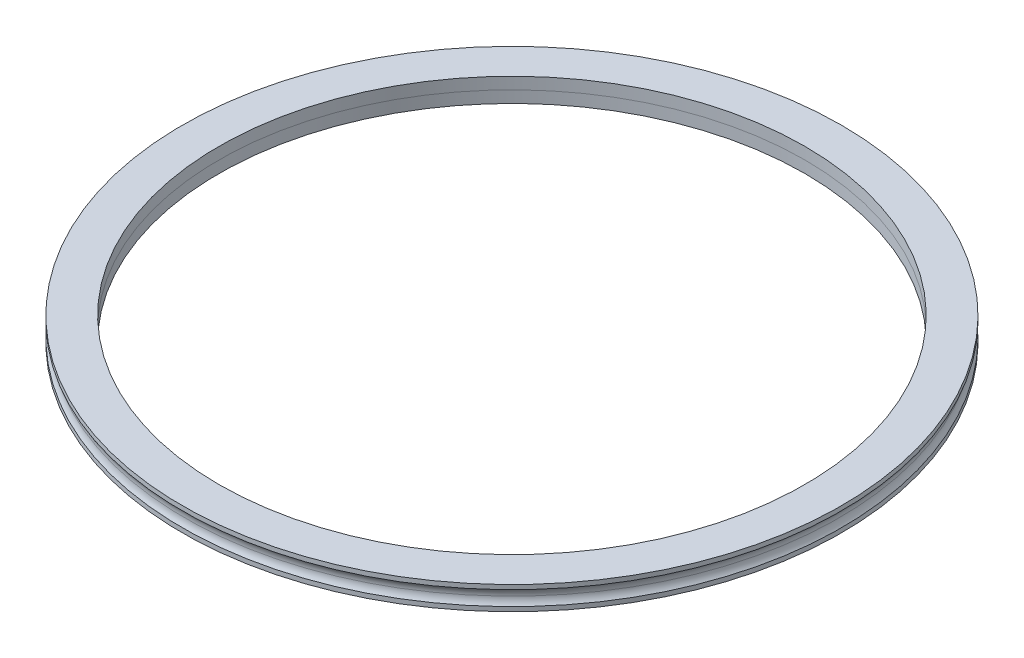
ISO-10303-21;
HEADER;
FILE_DESCRIPTION(('STEP AP214'),'2;1');
FILE_NAME('part.step','',(''),(''),'','','');
FILE_SCHEMA(('AUTOMOTIVE_DESIGN { 1 0 10303 214 1 1 1 1 }'));
ENDSEC;
DATA;
#1=APPLICATION_CONTEXT('core data for automotive mechanical design processes');
#2=APPLICATION_PROTOCOL_DEFINITION('international standard','automotive_design',2000,#1);
#3=PRODUCT_CONTEXT('',#1,'mechanical');
#4=PRODUCT('Part','Part','',(#3));
#5=PRODUCT_RELATED_PRODUCT_CATEGORY('part','',(#4));
#6=PRODUCT_DEFINITION_FORMATION('','',#4);
#7=PRODUCT_DEFINITION_CONTEXT('part definition',#1,'design');
#8=PRODUCT_DEFINITION('design','',#6,#7);
#9=PRODUCT_DEFINITION_SHAPE('','',#8);
#10=(LENGTH_UNIT() NAMED_UNIT(*) SI_UNIT(.MILLI.,.METRE.));
#11=(NAMED_UNIT(*) PLANE_ANGLE_UNIT() SI_UNIT($,.RADIAN.));
#12=(NAMED_UNIT(*) SI_UNIT($,.STERADIAN.) SOLID_ANGLE_UNIT());
#13=UNCERTAINTY_MEASURE_WITH_UNIT(LENGTH_MEASURE(1.E-05),#10,'distance_accuracy_value','');
#14=(GEOMETRIC_REPRESENTATION_CONTEXT(3) GLOBAL_UNCERTAINTY_ASSIGNED_CONTEXT((#13)) GLOBAL_UNIT_ASSIGNED_CONTEXT((#10,
#11,#12)) REPRESENTATION_CONTEXT('',''));
#15=CARTESIAN_POINT('',(0.,0.,0.));
#16=DIRECTION('',(0.,0.,1.));
#17=DIRECTION('',(1.,0.,0.));
#18=AXIS2_PLACEMENT_3D('',#15,#16,#17);
#19=CARTESIAN_POINT('',(0.,10.5475,0.));
#20=DIRECTION('',(0.,1.,0.));
#21=DIRECTION('',(0.,0.,1.));
#22=AXIS2_PLACEMENT_3D('',#19,#20,#21);
#23=PLANE('',#22);
#24=CARTESIAN_POINT('',(0.,10.5475,0.));
#25=DIRECTION('',(0.,-1.,0.));
#26=DIRECTION('',(0.,0.,-1.));
#27=AXIS2_PLACEMENT_3D('',#24,#25,#26);
#28=CIRCLE('',#27,67.);
#29=CARTESIAN_POINT('',(0.,10.5475,-67.));
#30=VERTEX_POINT('',#29);
#31=EDGE_CURVE('E62',#30,#30,#28,.F.);
#32=ORIENTED_EDGE('',*,*,#31,.T.);
#33=EDGE_LOOP('',(#32));
#34=FACE_BOUND('',#33,.T.);
#35=CARTESIAN_POINT('',(0.,10.5475000000013,0.));
#36=DIRECTION('',(0.,1.,0.));
#37=DIRECTION('',(0.,0.,1.));
#38=AXIS2_PLACEMENT_3D('',#35,#36,#37);
#39=CIRCLE('',#38,60.);
#40=CARTESIAN_POINT('',(0.,10.5475000000013,60.));
#41=VERTEX_POINT('',#40);
#42=EDGE_CURVE('E50',#41,#41,#39,.F.);
#43=ORIENTED_EDGE('',*,*,#42,.T.);
#44=EDGE_LOOP('',(#43));
#45=FACE_BOUND('',#44,.T.);
#46=ADVANCED_FACE('F46',(#34,#45),#23,.T.);
#47=CARTESIAN_POINT('',(0.,10.5475,0.));
#48=DIRECTION('',(0.,-1.,0.));
#49=DIRECTION('',(0.,0.,-1.));
#50=AXIS2_PLACEMENT_3D('',#47,#48,#49);
#51=TOROIDAL_SURFACE('',#50,69.5,2.50000000000002);
#52=CARTESIAN_POINT('',(0.,9.04750000000831,0.));
#53=DIRECTION('',(0.,-1.,0.));
#54=DIRECTION('',(0.,0.,-1.));
#55=AXIS2_PLACEMENT_3D('',#52,#53,#54);
#56=CIRCLE('',#55,67.5);
#57=CARTESIAN_POINT('',(0.,9.04750000000831,-67.5));
#58=VERTEX_POINT('',#57);
#59=EDGE_CURVE('E59',#58,#58,#56,.T.);
#60=ORIENTED_EDGE('',*,*,#59,.F.);
#61=EDGE_LOOP('',(#60));
#62=FACE_BOUND('',#61,.T.);
#63=ORIENTED_EDGE('',*,*,#31,.F.);
#64=EDGE_LOOP('',(#63));
#65=FACE_BOUND('',#64,.T.);
#66=ADVANCED_FACE('F73',(#62,#65),#51,.F.);
#67=CARTESIAN_POINT('',(0.,-200069.047495165,0.));
#68=DIRECTION('',(0.,-1.,0.));
#69=DIRECTION('',(0.,0.,-1.));
#70=AXIS2_PLACEMENT_3D('',#67,#68,#69);
#71=CYLINDRICAL_SURFACE('',#70,60.);
#72=CARTESIAN_POINT('',(0.,8.13249999998789,0.));
#73=DIRECTION('',(0.,-1.,0.));
#74=DIRECTION('',(0.,0.,-1.));
#75=AXIS2_PLACEMENT_3D('',#72,#73,#74);
#76=CIRCLE('',#75,60.);
#77=CARTESIAN_POINT('',(0.,8.13249999998789,-60.));
#78=VERTEX_POINT('',#77);
#79=EDGE_CURVE('E12',#78,#78,#76,.T.);
#80=ORIENTED_EDGE('',*,*,#79,.T.);
#81=EDGE_LOOP('',(#80));
#82=FACE_BOUND('',#81,.T.);
#83=ORIENTED_EDGE('',*,*,#42,.F.);
#84=EDGE_LOOP('',(#83));
#85=FACE_BOUND('',#84,.T.);
#86=ADVANCED_FACE('F48',(#82,#85),#71,.F.);
#87=CARTESIAN_POINT('',(0.,-200069.047495165,0.));
#88=DIRECTION('',(0.,-1.,0.));
#89=DIRECTION('',(0.,0.,-1.));
#90=AXIS2_PLACEMENT_3D('',#87,#88,#89);
#91=CYLINDRICAL_SURFACE('',#90,67.5);
#92=CARTESIAN_POINT('',(0.,8.13249999998789,0.));
#93=DIRECTION('',(0.,-1.,0.));
#94=DIRECTION('',(0.,0.,-1.));
#95=AXIS2_PLACEMENT_3D('',#92,#93,#94);
#96=CIRCLE('',#95,67.5);
#97=CARTESIAN_POINT('',(0.,8.13249999998789,-67.5));
#98=VERTEX_POINT('',#97);
#99=EDGE_CURVE('E54',#98,#98,#96,.T.);
#100=ORIENTED_EDGE('',*,*,#99,.F.);
#101=EDGE_LOOP('',(#100));
#102=FACE_BOUND('',#101,.T.);
#103=ORIENTED_EDGE('',*,*,#59,.T.);
#104=EDGE_LOOP('',(#103));
#105=FACE_BOUND('',#104,.T.);
#106=ADVANCED_FACE('F72',(#102,#105),#91,.T.);
#107=CARTESIAN_POINT('',(-60.,8.13250000000001,0.));
#108=DIRECTION('',(0.,1.,0.));
#109=DIRECTION('',(0.,0.,1.));
#110=AXIS2_PLACEMENT_3D('',#107,#108,#109);
#111=PLANE('',#110);
#112=ORIENTED_EDGE('',*,*,#79,.F.);
#113=EDGE_LOOP('',(#112));
#114=FACE_BOUND('',#113,.T.);
#115=ORIENTED_EDGE('',*,*,#99,.T.);
#116=EDGE_LOOP('',(#115));
#117=FACE_BOUND('',#116,.T.);
#118=ADVANCED_FACE('F78',(#114,#117),#111,.F.);
#119=CLOSED_SHELL('',(#46,#66,#86,#106,#118));
#120=MANIFOLD_SOLID_BREP('B2',#119);
#121=CARTESIAN_POINT('',(0.,10.5475,0.));
#122=DIRECTION('',(0.,1.,0.));
#123=DIRECTION('',(0.,0.,1.));
#124=AXIS2_PLACEMENT_3D('',#121,#122,#123);
#125=PLANE('',#124);
#126=CARTESIAN_POINT('',(0.,10.5475000000013,0.));
#127=DIRECTION('',(0.,1.,0.));
#128=DIRECTION('',(0.,0.,1.));
#129=AXIS2_PLACEMENT_3D('',#126,#127,#128);
#130=CIRCLE('',#129,60.);
#131=CARTESIAN_POINT('',(0.,10.5475000000013,60.));
#132=VERTEX_POINT('',#131);
#133=EDGE_CURVE('E127',#132,#132,#130,.F.);
#134=ORIENTED_EDGE('',*,*,#133,.F.);
#135=EDGE_LOOP('',(#134));
#136=FACE_BOUND('',#135,.T.);
#137=CARTESIAN_POINT('',(0.,10.5475,0.));
#138=DIRECTION('',(0.,-1.,0.));
#139=DIRECTION('',(0.,0.,-1.));
#140=AXIS2_PLACEMENT_3D('',#137,#138,#139);
#141=CIRCLE('',#140,67.);
#142=CARTESIAN_POINT('',(0.,10.5475,-67.));
#143=VERTEX_POINT('',#142);
#144=EDGE_CURVE('E45',#143,#143,#141,.F.);
#145=ORIENTED_EDGE('',*,*,#144,.F.);
#146=EDGE_LOOP('',(#145));
#147=FACE_BOUND('',#146,.T.);
#148=ADVANCED_FACE('F121',(#136,#147),#125,.F.);
#149=CARTESIAN_POINT('',(0.,-200069.047495165,0.));
#150=DIRECTION('',(0.,-1.,0.));
#151=DIRECTION('',(0.,0.,-1.));
#152=AXIS2_PLACEMENT_3D('',#149,#150,#151);
#153=CYLINDRICAL_SURFACE('',#152,67.5);
#154=CARTESIAN_POINT('',(0.,12.0474999999942,0.));
#155=DIRECTION('',(0.,-1.,0.));
#156=DIRECTION('',(0.,0.,-1.));
#157=AXIS2_PLACEMENT_3D('',#154,#155,#156);
#158=CIRCLE('',#157,67.5);
#159=CARTESIAN_POINT('',(0.,12.0474999999942,-67.5));
#160=VERTEX_POINT('',#159);
#161=EDGE_CURVE('E140',#160,#160,#158,.T.);
#162=ORIENTED_EDGE('',*,*,#161,.F.);
#163=EDGE_LOOP('',(#162));
#164=FACE_BOUND('',#163,.T.);
#165=CARTESIAN_POINT('',(0.,12.9624999999862,0.));
#166=DIRECTION('',(0.,-1.,0.));
#167=DIRECTION('',(0.,0.,-1.));
#168=AXIS2_PLACEMENT_3D('',#165,#166,#167);
#169=CIRCLE('',#168,67.5);
#170=CARTESIAN_POINT('',(0.,12.9624999999862,-67.5));
#171=VERTEX_POINT('',#170);
#172=EDGE_CURVE('E135',#171,#171,#169,.T.);
#173=ORIENTED_EDGE('',*,*,#172,.T.);
#174=EDGE_LOOP('',(#173));
#175=FACE_BOUND('',#174,.T.);
#176=ADVANCED_FACE('F146',(#164,#175),#153,.T.);
#177=CARTESIAN_POINT('',(0.,10.5475,0.));
#178=DIRECTION('',(0.,-1.,0.));
#179=DIRECTION('',(0.,0.,-1.));
#180=AXIS2_PLACEMENT_3D('',#177,#178,#179);
#181=TOROIDAL_SURFACE('',#180,69.5,2.50000000000002);
#182=ORIENTED_EDGE('',*,*,#144,.T.);
#183=EDGE_LOOP('',(#182));
#184=FACE_BOUND('',#183,.T.);
#185=ORIENTED_EDGE('',*,*,#161,.T.);
#186=EDGE_LOOP('',(#185));
#187=FACE_BOUND('',#186,.T.);
#188=ADVANCED_FACE('F144',(#184,#187),#181,.F.);
#189=CARTESIAN_POINT('',(-60.,12.9625,0.));
#190=DIRECTION('',(0.,-1.,0.));
#191=DIRECTION('',(0.,0.,-1.));
#192=AXIS2_PLACEMENT_3D('',#189,#190,#191);
#193=PLANE('',#192);
#194=ORIENTED_EDGE('',*,*,#172,.F.);
#195=EDGE_LOOP('',(#194));
#196=FACE_BOUND('',#195,.T.);
#197=CARTESIAN_POINT('',(0.,12.9624999999862,0.));
#198=DIRECTION('',(0.,-1.,0.));
#199=DIRECTION('',(0.,0.,-1.));
#200=AXIS2_PLACEMENT_3D('',#197,#198,#199);
#201=CIRCLE('',#200,60.);
#202=CARTESIAN_POINT('',(0.,12.9624999999862,-60.));
#203=VERTEX_POINT('',#202);
#204=EDGE_CURVE('E131',#203,#203,#201,.T.);
#205=ORIENTED_EDGE('',*,*,#204,.T.);
#206=EDGE_LOOP('',(#205));
#207=FACE_BOUND('',#206,.T.);
#208=ADVANCED_FACE('F152',(#196,#207),#193,.F.);
#209=CARTESIAN_POINT('',(0.,-200069.047495165,0.));
#210=DIRECTION('',(0.,-1.,0.));
#211=DIRECTION('',(0.,0.,-1.));
#212=AXIS2_PLACEMENT_3D('',#209,#210,#211);
#213=CYLINDRICAL_SURFACE('',#212,60.);
#214=ORIENTED_EDGE('',*,*,#133,.T.);
#215=EDGE_LOOP('',(#214));
#216=FACE_BOUND('',#215,.T.);
#217=ORIENTED_EDGE('',*,*,#204,.F.);
#218=EDGE_LOOP('',(#217));
#219=FACE_BOUND('',#218,.T.);
#220=ADVANCED_FACE('F155',(#216,#219),#213,.F.);
#221=CLOSED_SHELL('',(#148,#176,#188,#208,#220));
#222=MANIFOLD_SOLID_BREP('B7',#221);
#223=ADVANCED_BREP_SHAPE_REPRESENTATION('',(#18,#120,#222),#14);
#224=SHAPE_DEFINITION_REPRESENTATION(#9,#223);
ENDSEC;
END-ISO-10303-21;
